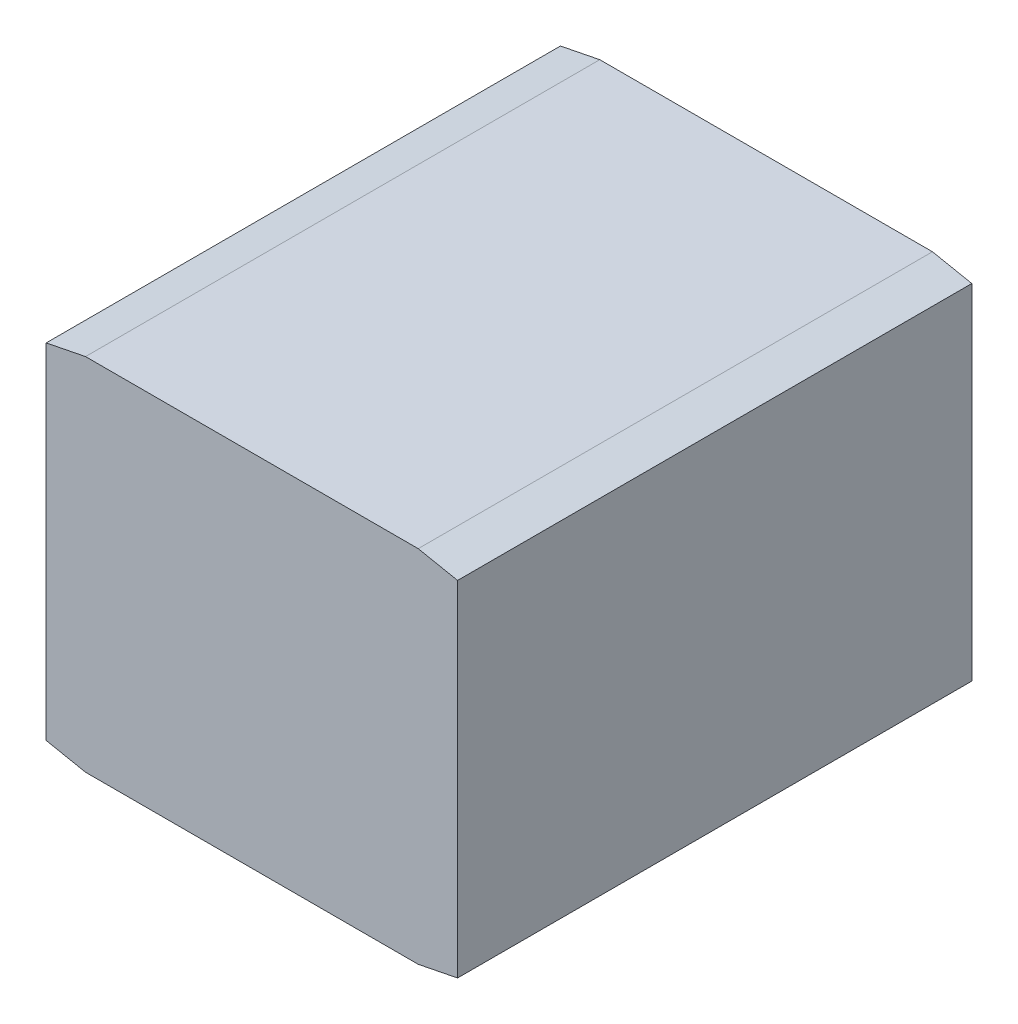
ISO-10303-21;
HEADER;
FILE_DESCRIPTION(('STEP AP214'),'2;1');
FILE_NAME('part.step','',(''),(''),'','','');
FILE_SCHEMA(('AUTOMOTIVE_DESIGN { 1 0 10303 214 1 1 1 1 }'));
ENDSEC;
DATA;
#1=APPLICATION_CONTEXT('core data for automotive mechanical design processes');
#2=APPLICATION_PROTOCOL_DEFINITION('international standard','automotive_design',2000,#1);
#3=PRODUCT_CONTEXT('',#1,'mechanical');
#4=PRODUCT('Part','Part','',(#3));
#5=PRODUCT_RELATED_PRODUCT_CATEGORY('part','',(#4));
#6=PRODUCT_DEFINITION_FORMATION('','',#4);
#7=PRODUCT_DEFINITION_CONTEXT('part definition',#1,'design');
#8=PRODUCT_DEFINITION('design','',#6,#7);
#9=PRODUCT_DEFINITION_SHAPE('','',#8);
#10=(LENGTH_UNIT() NAMED_UNIT(*) SI_UNIT(.MILLI.,.METRE.));
#11=(NAMED_UNIT(*) PLANE_ANGLE_UNIT() SI_UNIT($,.RADIAN.));
#12=(NAMED_UNIT(*) SI_UNIT($,.STERADIAN.) SOLID_ANGLE_UNIT());
#13=UNCERTAINTY_MEASURE_WITH_UNIT(LENGTH_MEASURE(1.E-05),#10,'distance_accuracy_value','');
#14=(GEOMETRIC_REPRESENTATION_CONTEXT(3) GLOBAL_UNCERTAINTY_ASSIGNED_CONTEXT((#13)) GLOBAL_UNIT_ASSIGNED_CONTEXT((#10,
#11,#12)) REPRESENTATION_CONTEXT('',''));
#15=CARTESIAN_POINT('',(0.,0.,0.));
#16=DIRECTION('',(0.,0.,1.));
#17=DIRECTION('',(1.,0.,0.));
#18=AXIS2_PLACEMENT_3D('',#15,#16,#17);
#19=CARTESIAN_POINT('',(4.,-3.34775568718525,10.));
#20=DIRECTION('',(-1.,0.,0.));
#21=DIRECTION('',(0.,0.,1.));
#22=AXIS2_PLACEMENT_3D('',#19,#20,#21);
#23=PLANE('',#22);
#24=DIRECTION('',(0.,1.,0.));
#25=VECTOR('',#24,1.);
#26=CARTESIAN_POINT('',(4.,-3.34775568718525,0.));
#27=LINE('',#26,#25);
#28=CARTESIAN_POINT('',(4.,-3.34775568718525,0.));
#29=VERTEX_POINT('',#28);
#30=CARTESIAN_POINT('',(4.,3.34775568718525,0.));
#31=VERTEX_POINT('',#30);
#32=EDGE_CURVE('E129',#29,#31,#27,.T.);
#33=ORIENTED_EDGE('',*,*,#32,.T.);
#34=DIRECTION('',(0.,0.,-1.));
#35=VECTOR('',#34,1.);
#36=CARTESIAN_POINT('',(4.,3.34775568718525,10.));
#37=LINE('',#36,#35);
#38=CARTESIAN_POINT('',(4.,3.34775568718525,10.));
#39=VERTEX_POINT('',#38);
#40=EDGE_CURVE('E11',#39,#31,#37,.T.);
#41=ORIENTED_EDGE('',*,*,#40,.F.);
#42=DIRECTION('',(0.,1.,0.));
#43=VECTOR('',#42,1.);
#44=CARTESIAN_POINT('',(4.,-3.34775568718525,10.));
#45=LINE('',#44,#43);
#46=CARTESIAN_POINT('',(4.,-3.34775568718525,10.));
#47=VERTEX_POINT('',#46);
#48=EDGE_CURVE('E143',#47,#39,#45,.T.);
#49=ORIENTED_EDGE('',*,*,#48,.F.);
#50=DIRECTION('',(0.,0.,-1.));
#51=VECTOR('',#50,1.);
#52=CARTESIAN_POINT('',(4.,-3.34775568718525,10.));
#53=LINE('',#52,#51);
#54=EDGE_CURVE('E125',#47,#29,#53,.T.);
#55=ORIENTED_EDGE('',*,*,#54,.T.);
#56=EDGE_LOOP('',(#33,#41,#49,#55));
#57=FACE_BOUND('',#56,.T.);
#58=ADVANCED_FACE('F33',(#57),#23,.F.);
#59=CARTESIAN_POINT('',(4.,3.34775568718525,10.));
#60=DIRECTION('',(-0.195090322016135,-0.980785280403229,0.));
#61=DIRECTION('',(0.980785280403229,-0.195090322016135,0.));
#62=AXIS2_PLACEMENT_3D('',#59,#60,#61);
#63=PLANE('',#62);
#64=DIRECTION('',(-0.980785280403229,0.195090322016135,0.));
#65=VECTOR('',#64,1.);
#66=CARTESIAN_POINT('',(4.,3.34775568718525,0.));
#67=LINE('',#66,#65);
#68=CARTESIAN_POINT('',(3.23461615373482,3.50000000000001,0.));
#69=VERTEX_POINT('',#68);
#70=EDGE_CURVE('E132',#31,#69,#67,.T.);
#71=ORIENTED_EDGE('',*,*,#70,.T.);
#72=DIRECTION('',(0.,0.,-1.));
#73=VECTOR('',#72,1.);
#74=CARTESIAN_POINT('',(3.23461615373482,3.50000000000001,10.));
#75=LINE('',#74,#73);
#76=CARTESIAN_POINT('',(3.23461615373482,3.50000000000001,10.));
#77=VERTEX_POINT('',#76);
#78=EDGE_CURVE('E41',#77,#69,#75,.T.);
#79=ORIENTED_EDGE('',*,*,#78,.F.);
#80=DIRECTION('',(-0.980785280403229,0.195090322016135,0.));
#81=VECTOR('',#80,1.);
#82=CARTESIAN_POINT('',(4.,3.34775568718525,10.));
#83=LINE('',#82,#81);
#84=EDGE_CURVE('E92',#39,#77,#83,.T.);
#85=ORIENTED_EDGE('',*,*,#84,.F.);
#86=ORIENTED_EDGE('',*,*,#40,.T.);
#87=EDGE_LOOP('',(#71,#79,#85,#86));
#88=FACE_BOUND('',#87,.T.);
#89=ADVANCED_FACE('F178',(#88),#63,.F.);
#90=CARTESIAN_POINT('',(-3.23461615373481,3.5,10.));
#91=DIRECTION('',(0.,-1.,0.));
#92=DIRECTION('',(1.,0.,0.));
#93=AXIS2_PLACEMENT_3D('',#90,#91,#92);
#94=PLANE('',#93);
#95=DIRECTION('',(-1.,0.,0.));
#96=VECTOR('',#95,1.);
#97=CARTESIAN_POINT('',(-3.23461615373481,3.5,0.));
#98=LINE('',#97,#96);
#99=CARTESIAN_POINT('',(-3.23461615373481,3.5,0.));
#100=VERTEX_POINT('',#99);
#101=EDGE_CURVE('E134',#69,#100,#98,.T.);
#102=ORIENTED_EDGE('',*,*,#101,.T.);
#103=DIRECTION('',(0.,0.,-1.));
#104=VECTOR('',#103,1.);
#105=CARTESIAN_POINT('',(-3.23461615373481,3.5,10.));
#106=LINE('',#105,#104);
#107=CARTESIAN_POINT('',(-3.23461615373481,3.5,10.));
#108=VERTEX_POINT('',#107);
#109=EDGE_CURVE('E150',#108,#100,#106,.T.);
#110=ORIENTED_EDGE('',*,*,#109,.F.);
#111=DIRECTION('',(-1.,0.,0.));
#112=VECTOR('',#111,1.);
#113=CARTESIAN_POINT('',(-3.23461615373481,3.5,10.));
#114=LINE('',#113,#112);
#115=EDGE_CURVE('E158',#77,#108,#114,.T.);
#116=ORIENTED_EDGE('',*,*,#115,.F.);
#117=ORIENTED_EDGE('',*,*,#78,.T.);
#118=EDGE_LOOP('',(#102,#110,#116,#117));
#119=FACE_BOUND('',#118,.T.);
#120=ADVANCED_FACE('F156',(#119),#94,.F.);
#121=CARTESIAN_POINT('',(-4.,3.34775568718525,10.));
#122=DIRECTION('',(0.195090322016123,-0.980785280403232,0.));
#123=DIRECTION('',(0.980785280403232,0.195090322016123,0.));
#124=AXIS2_PLACEMENT_3D('',#121,#122,#123);
#125=PLANE('',#124);
#126=DIRECTION('',(-0.980785280403232,-0.195090322016123,0.));
#127=VECTOR('',#126,1.);
#128=CARTESIAN_POINT('',(-4.,3.34775568718525,0.));
#129=LINE('',#128,#127);
#130=CARTESIAN_POINT('',(-4.,3.34775568718525,0.));
#131=VERTEX_POINT('',#130);
#132=EDGE_CURVE('E136',#100,#131,#129,.T.);
#133=ORIENTED_EDGE('',*,*,#132,.T.);
#134=DIRECTION('',(0.,0.,-1.));
#135=VECTOR('',#134,1.);
#136=CARTESIAN_POINT('',(-4.,3.34775568718525,10.));
#137=LINE('',#136,#135);
#138=CARTESIAN_POINT('',(-4.,3.34775568718525,10.));
#139=VERTEX_POINT('',#138);
#140=EDGE_CURVE('E147',#139,#131,#137,.T.);
#141=ORIENTED_EDGE('',*,*,#140,.F.);
#142=DIRECTION('',(-0.980785280403232,-0.195090322016123,0.));
#143=VECTOR('',#142,1.);
#144=CARTESIAN_POINT('',(-4.,3.34775568718525,10.));
#145=LINE('',#144,#143);
#146=EDGE_CURVE('E170',#108,#139,#145,.T.);
#147=ORIENTED_EDGE('',*,*,#146,.F.);
#148=ORIENTED_EDGE('',*,*,#109,.T.);
#149=EDGE_LOOP('',(#133,#141,#147,#148));
#150=FACE_BOUND('',#149,.T.);
#151=ADVANCED_FACE('F166',(#150),#125,.F.);
#152=CARTESIAN_POINT('',(-4.,-3.34775568718525,10.));
#153=DIRECTION('',(1.,0.,0.));
#154=DIRECTION('',(0.,0.,-1.));
#155=AXIS2_PLACEMENT_3D('',#152,#153,#154);
#156=PLANE('',#155);
#157=DIRECTION('',(0.,-1.,0.));
#158=VECTOR('',#157,1.);
#159=CARTESIAN_POINT('',(-4.,-3.34775568718525,0.));
#160=LINE('',#159,#158);
#161=CARTESIAN_POINT('',(-4.,-3.34775568718525,0.));
#162=VERTEX_POINT('',#161);
#163=EDGE_CURVE('E138',#131,#162,#160,.T.);
#164=ORIENTED_EDGE('',*,*,#163,.T.);
#165=DIRECTION('',(0.,0.,-1.));
#166=VECTOR('',#165,1.);
#167=CARTESIAN_POINT('',(-4.,-3.34775568718525,10.));
#168=LINE('',#167,#166);
#169=CARTESIAN_POINT('',(-4.,-3.34775568718525,10.));
#170=VERTEX_POINT('',#169);
#171=EDGE_CURVE('E120',#170,#162,#168,.T.);
#172=ORIENTED_EDGE('',*,*,#171,.F.);
#173=DIRECTION('',(0.,-1.,0.));
#174=VECTOR('',#173,1.);
#175=CARTESIAN_POINT('',(-4.,-3.34775568718525,10.));
#176=LINE('',#175,#174);
#177=EDGE_CURVE('E111',#139,#170,#176,.T.);
#178=ORIENTED_EDGE('',*,*,#177,.F.);
#179=ORIENTED_EDGE('',*,*,#140,.T.);
#180=EDGE_LOOP('',(#164,#172,#178,#179));
#181=FACE_BOUND('',#180,.T.);
#182=ADVANCED_FACE('F169',(#181),#156,.F.);
#183=CARTESIAN_POINT('',(-4.,-3.34775568718525,10.));
#184=DIRECTION('',(0.195090322016123,0.980785280403232,0.));
#185=DIRECTION('',(-0.980785280403232,0.195090322016123,0.));
#186=AXIS2_PLACEMENT_3D('',#183,#184,#185);
#187=PLANE('',#186);
#188=DIRECTION('',(0.980785280403232,-0.195090322016123,0.));
#189=VECTOR('',#188,1.);
#190=CARTESIAN_POINT('',(-4.,-3.34775568718525,0.));
#191=LINE('',#190,#189);
#192=CARTESIAN_POINT('',(-3.23461615373481,-3.5,0.));
#193=VERTEX_POINT('',#192);
#194=EDGE_CURVE('E119',#162,#193,#191,.T.);
#195=ORIENTED_EDGE('',*,*,#194,.T.);
#196=DIRECTION('',(0.,0.,-1.));
#197=VECTOR('',#196,1.);
#198=CARTESIAN_POINT('',(-3.23461615373481,-3.5,10.));
#199=LINE('',#198,#197);
#200=CARTESIAN_POINT('',(-3.23461615373481,-3.5,10.));
#201=VERTEX_POINT('',#200);
#202=EDGE_CURVE('E116',#201,#193,#199,.T.);
#203=ORIENTED_EDGE('',*,*,#202,.F.);
#204=DIRECTION('',(0.980785280403232,-0.195090322016123,0.));
#205=VECTOR('',#204,1.);
#206=CARTESIAN_POINT('',(-4.,-3.34775568718525,10.));
#207=LINE('',#206,#205);
#208=EDGE_CURVE('E105',#170,#201,#207,.T.);
#209=ORIENTED_EDGE('',*,*,#208,.F.);
#210=ORIENTED_EDGE('',*,*,#171,.T.);
#211=EDGE_LOOP('',(#195,#203,#209,#210));
#212=FACE_BOUND('',#211,.T.);
#213=ADVANCED_FACE('F117',(#212),#187,.F.);
#214=CARTESIAN_POINT('',(-3.23461615373481,-3.5,10.));
#215=DIRECTION('',(0.,1.,0.));
#216=DIRECTION('',(-1.,0.,0.));
#217=AXIS2_PLACEMENT_3D('',#214,#215,#216);
#218=PLANE('',#217);
#219=DIRECTION('',(1.,0.,0.));
#220=VECTOR('',#219,1.);
#221=CARTESIAN_POINT('',(-3.23461615373481,-3.5,0.));
#222=LINE('',#221,#220);
#223=CARTESIAN_POINT('',(3.23461615373482,-3.50000000000001,0.));
#224=VERTEX_POINT('',#223);
#225=EDGE_CURVE('E78',#193,#224,#222,.T.);
#226=ORIENTED_EDGE('',*,*,#225,.T.);
#227=DIRECTION('',(0.,0.,-1.));
#228=VECTOR('',#227,1.);
#229=CARTESIAN_POINT('',(3.23461615373482,-3.50000000000001,10.));
#230=LINE('',#229,#228);
#231=CARTESIAN_POINT('',(3.23461615373482,-3.50000000000001,10.));
#232=VERTEX_POINT('',#231);
#233=EDGE_CURVE('E121',#232,#224,#230,.T.);
#234=ORIENTED_EDGE('',*,*,#233,.F.);
#235=DIRECTION('',(1.,0.,0.));
#236=VECTOR('',#235,1.);
#237=CARTESIAN_POINT('',(-3.23461615373481,-3.5,10.));
#238=LINE('',#237,#236);
#239=EDGE_CURVE('E109',#201,#232,#238,.T.);
#240=ORIENTED_EDGE('',*,*,#239,.F.);
#241=ORIENTED_EDGE('',*,*,#202,.T.);
#242=EDGE_LOOP('',(#226,#234,#240,#241));
#243=FACE_BOUND('',#242,.T.);
#244=ADVANCED_FACE('F123',(#243),#218,.F.);
#245=CARTESIAN_POINT('',(4.,-3.34775568718525,10.));
#246=DIRECTION('',(-0.195090322016135,0.980785280403229,0.));
#247=DIRECTION('',(-0.980785280403229,-0.195090322016135,0.));
#248=AXIS2_PLACEMENT_3D('',#245,#246,#247);
#249=PLANE('',#248);
#250=DIRECTION('',(0.980785280403229,0.195090322016135,0.));
#251=VECTOR('',#250,1.);
#252=CARTESIAN_POINT('',(4.,-3.34775568718525,0.));
#253=LINE('',#252,#251);
#254=EDGE_CURVE('E84',#224,#29,#253,.T.);
#255=ORIENTED_EDGE('',*,*,#254,.T.);
#256=ORIENTED_EDGE('',*,*,#54,.F.);
#257=DIRECTION('',(0.980785280403229,0.195090322016135,0.));
#258=VECTOR('',#257,1.);
#259=CARTESIAN_POINT('',(4.,-3.34775568718525,10.));
#260=LINE('',#259,#258);
#261=EDGE_CURVE('E49',#232,#47,#260,.T.);
#262=ORIENTED_EDGE('',*,*,#261,.F.);
#263=ORIENTED_EDGE('',*,*,#233,.T.);
#264=EDGE_LOOP('',(#255,#256,#262,#263));
#265=FACE_BOUND('',#264,.T.);
#266=ADVANCED_FACE('F194',(#265),#249,.F.);
#267=CARTESIAN_POINT('',(0.,0.,10.));
#268=DIRECTION('',(0.,0.,-1.));
#269=DIRECTION('',(-1.,0.,0.));
#270=AXIS2_PLACEMENT_3D('',#267,#268,#269);
#271=PLANE('',#270);
#272=ORIENTED_EDGE('',*,*,#48,.T.);
#273=ORIENTED_EDGE('',*,*,#84,.T.);
#274=ORIENTED_EDGE('',*,*,#115,.T.);
#275=ORIENTED_EDGE('',*,*,#146,.T.);
#276=ORIENTED_EDGE('',*,*,#177,.T.);
#277=ORIENTED_EDGE('',*,*,#208,.T.);
#278=ORIENTED_EDGE('',*,*,#239,.T.);
#279=ORIENTED_EDGE('',*,*,#261,.T.);
#280=EDGE_LOOP('',(#272,#273,#274,#275,#276,#277,#278,#279));
#281=FACE_BOUND('',#280,.T.);
#282=ADVANCED_FACE('F107',(#281),#271,.F.);
#283=CARTESIAN_POINT('',(0.,0.,0.));
#284=DIRECTION('',(0.,0.,-1.));
#285=DIRECTION('',(-1.,0.,0.));
#286=AXIS2_PLACEMENT_3D('',#283,#284,#285);
#287=PLANE('',#286);
#288=ORIENTED_EDGE('',*,*,#32,.F.);
#289=ORIENTED_EDGE('',*,*,#254,.F.);
#290=ORIENTED_EDGE('',*,*,#225,.F.);
#291=ORIENTED_EDGE('',*,*,#194,.F.);
#292=ORIENTED_EDGE('',*,*,#163,.F.);
#293=ORIENTED_EDGE('',*,*,#132,.F.);
#294=ORIENTED_EDGE('',*,*,#101,.F.);
#295=ORIENTED_EDGE('',*,*,#70,.F.);
#296=EDGE_LOOP('',(#288,#289,#290,#291,#292,#293,#294,#295));
#297=FACE_BOUND('',#296,.T.);
#298=ADVANCED_FACE('F162',(#297),#287,.T.);
#299=CLOSED_SHELL('',(#58,#89,#120,#151,#182,#213,#244,#266,#282,#298));
#300=MANIFOLD_SOLID_BREP('B2',#299);
#301=ADVANCED_BREP_SHAPE_REPRESENTATION('',(#18,#300),#14);
#302=SHAPE_DEFINITION_REPRESENTATION(#9,#301);
ENDSEC;
END-ISO-10303-21;
